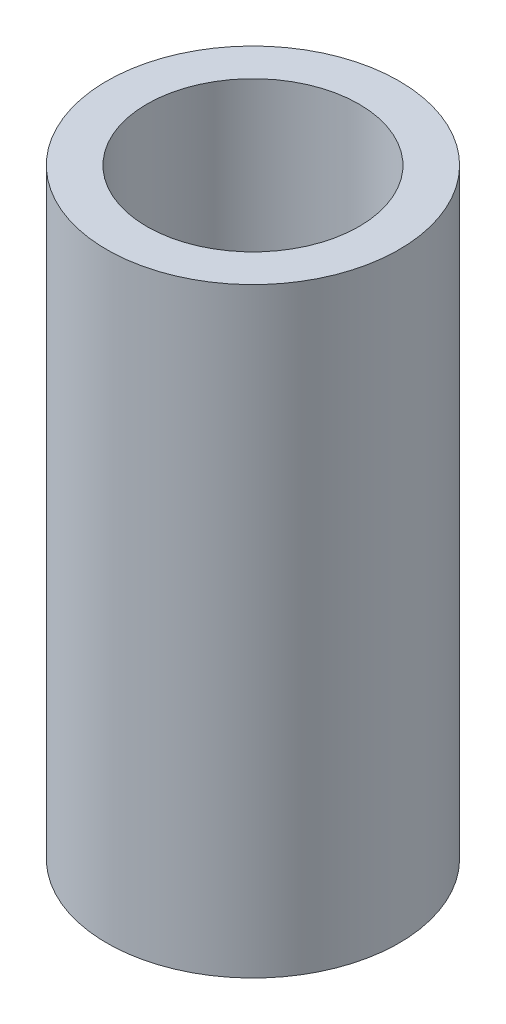
ISO-10303-21;
HEADER;
FILE_DESCRIPTION(('STEP AP214'),'2;1');
FILE_NAME('part.step','',(''),(''),'','','');
FILE_SCHEMA(('AUTOMOTIVE_DESIGN { 1 0 10303 214 1 1 1 1 }'));
ENDSEC;
DATA;
#1=APPLICATION_CONTEXT('core data for automotive mechanical design processes');
#2=APPLICATION_PROTOCOL_DEFINITION('international standard','automotive_design',2000,#1);
#3=PRODUCT_CONTEXT('',#1,'mechanical');
#4=PRODUCT('Part','Part','',(#3));
#5=PRODUCT_RELATED_PRODUCT_CATEGORY('part','',(#4));
#6=PRODUCT_DEFINITION_FORMATION('','',#4);
#7=PRODUCT_DEFINITION_CONTEXT('part definition',#1,'design');
#8=PRODUCT_DEFINITION('design','',#6,#7);
#9=PRODUCT_DEFINITION_SHAPE('','',#8);
#10=(LENGTH_UNIT() NAMED_UNIT(*) SI_UNIT(.MILLI.,.METRE.));
#11=(NAMED_UNIT(*) PLANE_ANGLE_UNIT() SI_UNIT($,.RADIAN.));
#12=(NAMED_UNIT(*) SI_UNIT($,.STERADIAN.) SOLID_ANGLE_UNIT());
#13=UNCERTAINTY_MEASURE_WITH_UNIT(LENGTH_MEASURE(1.E-05),#10,'distance_accuracy_value','');
#14=(GEOMETRIC_REPRESENTATION_CONTEXT(3) GLOBAL_UNCERTAINTY_ASSIGNED_CONTEXT((#13)) GLOBAL_UNIT_ASSIGNED_CONTEXT((#10,
#11,#12)) REPRESENTATION_CONTEXT('',''));
#15=CARTESIAN_POINT('',(0.,0.,0.));
#16=DIRECTION('',(0.,0.,1.));
#17=DIRECTION('',(1.,0.,0.));
#18=AXIS2_PLACEMENT_3D('',#15,#16,#17);
#19=CARTESIAN_POINT('',(0.,-76.2,0.));
#20=DIRECTION('',(0.,-1.,0.));
#21=DIRECTION('',(0.,0.,-1.));
#22=AXIS2_PLACEMENT_3D('',#19,#20,#21);
#23=CYLINDRICAL_SURFACE('',#22,13.462);
#24=CARTESIAN_POINT('',(0.,-44.45,0.));
#25=DIRECTION('',(0.,-1.,0.));
#26=DIRECTION('',(0.,0.,-1.));
#27=AXIS2_PLACEMENT_3D('',#24,#25,#26);
#28=CIRCLE('',#27,13.462);
#29=CARTESIAN_POINT('',(0.,-44.45,-13.462));
#30=VERTEX_POINT('',#29);
#31=EDGE_CURVE('E54',#30,#30,#28,.T.);
#32=ORIENTED_EDGE('',*,*,#31,.T.);
#33=EDGE_LOOP('',(#32));
#34=FACE_BOUND('',#33,.T.);
#35=CARTESIAN_POINT('',(0.,0.,0.));
#36=DIRECTION('',(0.,-1.,0.));
#37=DIRECTION('',(0.,0.,-1.));
#38=AXIS2_PLACEMENT_3D('',#35,#36,#37);
#39=CIRCLE('',#38,13.462);
#40=CARTESIAN_POINT('',(0.,0.,-13.462));
#41=VERTEX_POINT('',#40);
#42=EDGE_CURVE('E10',#41,#41,#39,.T.);
#43=ORIENTED_EDGE('',*,*,#42,.F.);
#44=EDGE_LOOP('',(#43));
#45=FACE_BOUND('',#44,.T.);
#46=ADVANCED_FACE('F37',(#34,#45),#23,.F.);
#47=CARTESIAN_POINT('',(13.462,0.,0.));
#48=DIRECTION('',(0.,1.,0.));
#49=DIRECTION('',(0.,0.,1.));
#50=AXIS2_PLACEMENT_3D('',#47,#48,#49);
#51=PLANE('',#50);
#52=ORIENTED_EDGE('',*,*,#42,.T.);
#53=EDGE_LOOP('',(#52));
#54=FACE_BOUND('',#53,.T.);
#55=CARTESIAN_POINT('',(0.,0.,0.));
#56=DIRECTION('',(0.,-1.,0.));
#57=DIRECTION('',(0.,0.,-1.));
#58=AXIS2_PLACEMENT_3D('',#55,#56,#57);
#59=CIRCLE('',#58,18.542);
#60=CARTESIAN_POINT('',(0.,0.,-18.542));
#61=VERTEX_POINT('',#60);
#62=EDGE_CURVE('E44',#61,#61,#59,.T.);
#63=ORIENTED_EDGE('',*,*,#62,.F.);
#64=EDGE_LOOP('',(#63));
#65=FACE_BOUND('',#64,.T.);
#66=ADVANCED_FACE('F74',(#54,#65),#51,.T.);
#67=CARTESIAN_POINT('',(0.,-76.2,0.));
#68=DIRECTION('',(0.,-1.,0.));
#69=DIRECTION('',(0.,0.,-1.));
#70=AXIS2_PLACEMENT_3D('',#67,#68,#69);
#71=CYLINDRICAL_SURFACE('',#70,18.542);
#72=ORIENTED_EDGE('',*,*,#62,.T.);
#73=EDGE_LOOP('',(#72));
#74=FACE_BOUND('',#73,.T.);
#75=CARTESIAN_POINT('',(0.,-76.2,0.));
#76=DIRECTION('',(0.,-1.,0.));
#77=DIRECTION('',(0.,0.,-1.));
#78=AXIS2_PLACEMENT_3D('',#75,#76,#77);
#79=CIRCLE('',#78,18.542);
#80=CARTESIAN_POINT('',(0.,-76.2,-18.542));
#81=VERTEX_POINT('',#80);
#82=EDGE_CURVE('E49',#81,#81,#79,.T.);
#83=ORIENTED_EDGE('',*,*,#82,.F.);
#84=EDGE_LOOP('',(#83));
#85=FACE_BOUND('',#84,.T.);
#86=ADVANCED_FACE('F70',(#74,#85),#71,.T.);
#87=CARTESIAN_POINT('',(18.542,-76.2,0.));
#88=DIRECTION('',(0.,-1.,0.));
#89=DIRECTION('',(0.,0.,-1.));
#90=AXIS2_PLACEMENT_3D('',#87,#88,#89);
#91=PLANE('',#90);
#92=ORIENTED_EDGE('',*,*,#82,.T.);
#93=EDGE_LOOP('',(#92));
#94=FACE_BOUND('',#93,.T.);
#95=ADVANCED_FACE('F65',(#94),#91,.T.);
#96=CARTESIAN_POINT('',(0.,-44.45,0.));
#97=DIRECTION('',(0.,1.,0.));
#98=DIRECTION('',(0.,0.,1.));
#99=AXIS2_PLACEMENT_3D('',#96,#97,#98);
#100=PLANE('',#99);
#101=ORIENTED_EDGE('',*,*,#31,.F.);
#102=EDGE_LOOP('',(#101));
#103=FACE_BOUND('',#102,.T.);
#104=ADVANCED_FACE('F63',(#103),#100,.T.);
#105=CLOSED_SHELL('',(#46,#66,#86,#95,#104));
#106=MANIFOLD_SOLID_BREP('B2',#105);
#107=ADVANCED_BREP_SHAPE_REPRESENTATION('',(#18,#106),#14);
#108=SHAPE_DEFINITION_REPRESENTATION(#9,#107);
ENDSEC;
END-ISO-10303-21;
